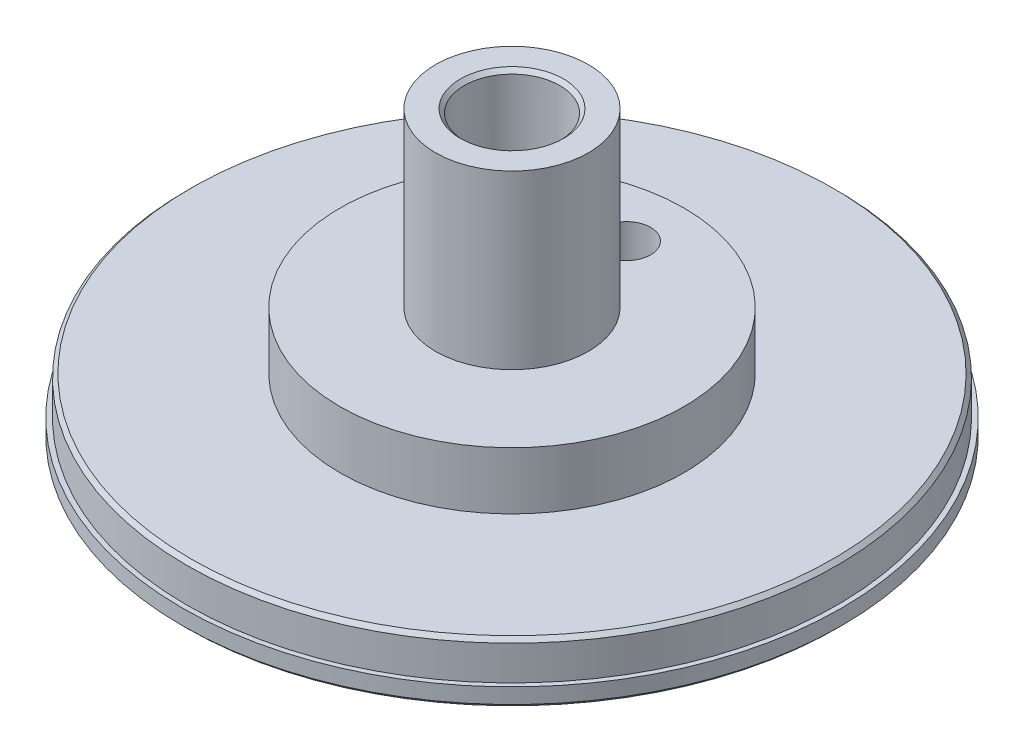
ISO-10303-21;
HEADER;
FILE_DESCRIPTION(('STEP AP214'),'2;1');
FILE_NAME('part.step','',(''),(''),'','','');
FILE_SCHEMA(('AUTOMOTIVE_DESIGN { 1 0 10303 214 1 1 1 1 }'));
ENDSEC;
DATA;
#1=APPLICATION_CONTEXT('core data for automotive mechanical design processes');
#2=APPLICATION_PROTOCOL_DEFINITION('international standard','automotive_design',2000,#1);
#3=PRODUCT_CONTEXT('',#1,'mechanical');
#4=PRODUCT('Part','Part','',(#3));
#5=PRODUCT_RELATED_PRODUCT_CATEGORY('part','',(#4));
#6=PRODUCT_DEFINITION_FORMATION('','',#4);
#7=PRODUCT_DEFINITION_CONTEXT('part definition',#1,'design');
#8=PRODUCT_DEFINITION('design','',#6,#7);
#9=PRODUCT_DEFINITION_SHAPE('','',#8);
#10=(LENGTH_UNIT() NAMED_UNIT(*) SI_UNIT(.MILLI.,.METRE.));
#11=(NAMED_UNIT(*) PLANE_ANGLE_UNIT() SI_UNIT($,.RADIAN.));
#12=(NAMED_UNIT(*) SI_UNIT($,.STERADIAN.) SOLID_ANGLE_UNIT());
#13=UNCERTAINTY_MEASURE_WITH_UNIT(LENGTH_MEASURE(1.E-05),#10,'distance_accuracy_value','');
#14=(GEOMETRIC_REPRESENTATION_CONTEXT(3) GLOBAL_UNCERTAINTY_ASSIGNED_CONTEXT((#13)) GLOBAL_UNIT_ASSIGNED_CONTEXT((#10,
#11,#12)) REPRESENTATION_CONTEXT('',''));
#15=CARTESIAN_POINT('',(0.,0.,0.));
#16=DIRECTION('',(0.,0.,1.));
#17=DIRECTION('',(1.,0.,0.));
#18=AXIS2_PLACEMENT_3D('',#15,#16,#17);
#19=CARTESIAN_POINT('',(0.,3.,0.));
#20=DIRECTION('',(0.,1.,0.));
#21=DIRECTION('',(0.,0.,1.));
#22=AXIS2_PLACEMENT_3D('',#19,#20,#21);
#23=CYLINDRICAL_SURFACE('',#22,9.);
#24=CARTESIAN_POINT('',(0.,3.,0.));
#25=DIRECTION('',(0.,1.,0.));
#26=DIRECTION('',(0.,0.,1.));
#27=AXIS2_PLACEMENT_3D('',#24,#25,#26);
#28=CIRCLE('',#27,9.);
#29=CARTESIAN_POINT('',(0.,3.,9.));
#30=VERTEX_POINT('',#29);
#31=EDGE_CURVE('E87',#30,#30,#28,.T.);
#32=ORIENTED_EDGE('',*,*,#31,.T.);
#33=EDGE_LOOP('',(#32));
#34=FACE_BOUND('',#33,.T.);
#35=CARTESIAN_POINT('',(0.,6.,0.));
#36=DIRECTION('',(0.,1.,0.));
#37=DIRECTION('',(0.,0.,1.));
#38=AXIS2_PLACEMENT_3D('',#35,#36,#37);
#39=CIRCLE('',#38,9.);
#40=CARTESIAN_POINT('',(0.,6.,9.));
#41=VERTEX_POINT('',#40);
#42=EDGE_CURVE('E83',#41,#41,#39,.F.);
#43=ORIENTED_EDGE('',*,*,#42,.T.);
#44=EDGE_LOOP('',(#43));
#45=FACE_BOUND('',#44,.T.);
#46=ADVANCED_FACE('F41',(#34,#45),#23,.T.);
#47=CARTESIAN_POINT('',(0.,0.999999999999999,0.));
#48=DIRECTION('',(0.,1.,0.));
#49=DIRECTION('',(0.,0.,1.));
#50=AXIS2_PLACEMENT_3D('',#47,#48,#49);
#51=CYLINDRICAL_SURFACE('',#50,17.);
#52=CARTESIAN_POINT('',(0.,2.8,0.));
#53=DIRECTION('',(0.,1.,0.));
#54=DIRECTION('',(0.,0.,1.));
#55=AXIS2_PLACEMENT_3D('',#52,#53,#54);
#56=CIRCLE('',#55,17.);
#57=CARTESIAN_POINT('',(0.,2.8,17.));
#58=VERTEX_POINT('',#57);
#59=EDGE_CURVE('E55',#58,#58,#56,.F.);
#60=ORIENTED_EDGE('',*,*,#59,.T.);
#61=EDGE_LOOP('',(#60));
#62=FACE_BOUND('',#61,.T.);
#63=CARTESIAN_POINT('',(0.,0.999999999999999,0.));
#64=DIRECTION('',(0.,1.,0.));
#65=DIRECTION('',(0.,0.,1.));
#66=AXIS2_PLACEMENT_3D('',#63,#64,#65);
#67=CIRCLE('',#66,17.);
#68=CARTESIAN_POINT('',(0.,0.999999999999999,17.));
#69=VERTEX_POINT('',#68);
#70=EDGE_CURVE('E92',#69,#69,#67,.T.);
#71=ORIENTED_EDGE('',*,*,#70,.T.);
#72=EDGE_LOOP('',(#71));
#73=FACE_BOUND('',#72,.T.);
#74=ADVANCED_FACE('F153',(#62,#73),#51,.T.);
#75=CARTESIAN_POINT('',(0.,15.,0.));
#76=DIRECTION('',(0.,-1.,0.));
#77=DIRECTION('',(0.,0.,-1.));
#78=AXIS2_PLACEMENT_3D('',#75,#76,#77);
#79=CYLINDRICAL_SURFACE('',#78,17.25);
#80=CARTESIAN_POINT('',(0.,0.199999999999999,0.));
#81=DIRECTION('',(0.,1.,0.));
#82=DIRECTION('',(0.,0.,1.));
#83=AXIS2_PLACEMENT_3D('',#80,#81,#82);
#84=CIRCLE('',#83,17.25);
#85=CARTESIAN_POINT('',(0.,0.199999999999999,17.25));
#86=VERTEX_POINT('',#85);
#87=EDGE_CURVE('E11',#86,#86,#84,.T.);
#88=ORIENTED_EDGE('',*,*,#87,.T.);
#89=EDGE_LOOP('',(#88));
#90=FACE_BOUND('',#89,.T.);
#91=CARTESIAN_POINT('',(0.,0.999999999999999,0.));
#92=DIRECTION('',(0.,1.,0.));
#93=DIRECTION('',(0.,0.,1.));
#94=AXIS2_PLACEMENT_3D('',#91,#92,#93);
#95=CIRCLE('',#94,17.25);
#96=CARTESIAN_POINT('',(0.,0.999999999999999,17.25));
#97=VERTEX_POINT('',#96);
#98=EDGE_CURVE('E82',#97,#97,#95,.T.);
#99=ORIENTED_EDGE('',*,*,#98,.F.);
#100=EDGE_LOOP('',(#99));
#101=FACE_BOUND('',#100,.T.);
#102=ADVANCED_FACE('F160',(#90,#101),#79,.T.);
#103=CARTESIAN_POINT('',(0.,0.,0.));
#104=DIRECTION('',(0.,1.,0.));
#105=DIRECTION('',(0.,0.,1.));
#106=AXIS2_PLACEMENT_3D('',#103,#104,#105);
#107=PLANE('',#106);
#108=CARTESIAN_POINT('',(0.,0.,0.));
#109=DIRECTION('',(0.,1.,0.));
#110=DIRECTION('',(0.,0.,1.));
#111=AXIS2_PLACEMENT_3D('',#108,#109,#110);
#112=CIRCLE('',#111,2.69999999999999);
#113=CARTESIAN_POINT('',(0.,0.,-2.69999999999999));
#114=VERTEX_POINT('',#113);
#115=EDGE_CURVE('E74',#114,#114,#112,.T.);
#116=ORIENTED_EDGE('',*,*,#115,.T.);
#117=EDGE_LOOP('',(#116));
#118=FACE_BOUND('',#117,.T.);
#119=CARTESIAN_POINT('',(0.,0.,0.));
#120=DIRECTION('',(0.,1.,0.));
#121=DIRECTION('',(0.,0.,1.));
#122=AXIS2_PLACEMENT_3D('',#119,#120,#121);
#123=CIRCLE('',#122,17.05);
#124=CARTESIAN_POINT('',(0.,0.,17.05));
#125=VERTEX_POINT('',#124);
#126=EDGE_CURVE('E78',#125,#125,#123,.F.);
#127=ORIENTED_EDGE('',*,*,#126,.T.);
#128=EDGE_LOOP('',(#127));
#129=FACE_BOUND('',#128,.T.);
#130=CARTESIAN_POINT('',(0.,0.,-6.));
#131=DIRECTION('',(0.,1.,0.));
#132=DIRECTION('',(0.,0.,1.));
#133=AXIS2_PLACEMENT_3D('',#130,#131,#132);
#134=CIRCLE('',#133,1.25);
#135=CARTESIAN_POINT('',(0.,0.,-4.75));
#136=VERTEX_POINT('',#135);
#137=EDGE_CURVE('E103',#136,#136,#134,.T.);
#138=ORIENTED_EDGE('',*,*,#137,.T.);
#139=EDGE_LOOP('',(#138));
#140=FACE_BOUND('',#139,.T.);
#141=ADVANCED_FACE('F115',(#118,#129,#140),#107,.F.);
#142=CARTESIAN_POINT('',(0.,0.999999999999999,0.));
#143=DIRECTION('',(0.,1.,0.));
#144=DIRECTION('',(0.,0.,1.));
#145=AXIS2_PLACEMENT_3D('',#142,#143,#144);
#146=PLANE('',#145);
#147=ORIENTED_EDGE('',*,*,#70,.F.);
#148=EDGE_LOOP('',(#147));
#149=FACE_BOUND('',#148,.T.);
#150=ORIENTED_EDGE('',*,*,#98,.T.);
#151=EDGE_LOOP('',(#150));
#152=FACE_BOUND('',#151,.T.);
#153=ADVANCED_FACE('F165',(#149,#152),#146,.T.);
#154=CARTESIAN_POINT('',(0.,3.,0.));
#155=DIRECTION('',(0.,1.,0.));
#156=DIRECTION('',(0.,0.,1.));
#157=AXIS2_PLACEMENT_3D('',#154,#155,#156);
#158=PLANE('',#157);
#159=CARTESIAN_POINT('',(0.,3.,0.));
#160=DIRECTION('',(0.,1.,0.));
#161=DIRECTION('',(0.,0.,1.));
#162=AXIS2_PLACEMENT_3D('',#159,#160,#161);
#163=CIRCLE('',#162,16.8);
#164=CARTESIAN_POINT('',(0.,3.,16.8));
#165=VERTEX_POINT('',#164);
#166=EDGE_CURVE('E50',#165,#165,#163,.T.);
#167=ORIENTED_EDGE('',*,*,#166,.T.);
#168=EDGE_LOOP('',(#167));
#169=FACE_BOUND('',#168,.T.);
#170=ORIENTED_EDGE('',*,*,#31,.F.);
#171=EDGE_LOOP('',(#170));
#172=FACE_BOUND('',#171,.T.);
#173=ADVANCED_FACE('F129',(#169,#172),#158,.T.);
#174=CARTESIAN_POINT('',(0.,6.,0.));
#175=DIRECTION('',(0.,1.,0.));
#176=DIRECTION('',(0.,0.,1.));
#177=AXIS2_PLACEMENT_3D('',#174,#175,#176);
#178=PLANE('',#177);
#179=CARTESIAN_POINT('',(0.,6.,-6.));
#180=DIRECTION('',(0.,1.,0.));
#181=DIRECTION('',(0.,0.,1.));
#182=AXIS2_PLACEMENT_3D('',#179,#180,#181);
#183=CIRCLE('',#182,1.25);
#184=CARTESIAN_POINT('',(0.,6.,-4.75));
#185=VERTEX_POINT('',#184);
#186=EDGE_CURVE('E107',#185,#185,#183,.T.);
#187=ORIENTED_EDGE('',*,*,#186,.F.);
#188=EDGE_LOOP('',(#187));
#189=FACE_BOUND('',#188,.T.);
#190=ORIENTED_EDGE('',*,*,#42,.F.);
#191=EDGE_LOOP('',(#190));
#192=FACE_BOUND('',#191,.T.);
#193=CARTESIAN_POINT('',(0.,6.,0.));
#194=DIRECTION('',(0.,1.,0.));
#195=DIRECTION('',(0.,0.,1.));
#196=AXIS2_PLACEMENT_3D('',#193,#194,#195);
#197=CIRCLE('',#196,4.);
#198=CARTESIAN_POINT('',(0.,6.,4.));
#199=VERTEX_POINT('',#198);
#200=EDGE_CURVE('E88',#199,#199,#197,.T.);
#201=ORIENTED_EDGE('',*,*,#200,.F.);
#202=EDGE_LOOP('',(#201));
#203=FACE_BOUND('',#202,.T.);
#204=ADVANCED_FACE('F125',(#189,#192,#203),#178,.T.);
#205=CARTESIAN_POINT('',(0.,6.,0.));
#206=DIRECTION('',(0.,1.,0.));
#207=DIRECTION('',(0.,0.,1.));
#208=AXIS2_PLACEMENT_3D('',#205,#206,#207);
#209=CYLINDRICAL_SURFACE('',#208,4.);
#210=ORIENTED_EDGE('',*,*,#200,.T.);
#211=EDGE_LOOP('',(#210));
#212=FACE_BOUND('',#211,.T.);
#213=CARTESIAN_POINT('',(0.,15.,0.));
#214=DIRECTION('',(0.,1.,0.));
#215=DIRECTION('',(0.,0.,1.));
#216=AXIS2_PLACEMENT_3D('',#213,#214,#215);
#217=CIRCLE('',#216,4.);
#218=CARTESIAN_POINT('',(0.,15.,4.));
#219=VERTEX_POINT('',#218);
#220=EDGE_CURVE('E99',#219,#219,#217,.T.);
#221=ORIENTED_EDGE('',*,*,#220,.F.);
#222=EDGE_LOOP('',(#221));
#223=FACE_BOUND('',#222,.T.);
#224=ADVANCED_FACE('F128',(#212,#223),#209,.T.);
#225=CARTESIAN_POINT('',(0.,15.,0.));
#226=DIRECTION('',(0.,1.,0.));
#227=DIRECTION('',(0.,0.,1.));
#228=AXIS2_PLACEMENT_3D('',#225,#226,#227);
#229=PLANE('',#228);
#230=CARTESIAN_POINT('',(0.,15.,0.));
#231=DIRECTION('',(0.,1.,0.));
#232=DIRECTION('',(0.,0.,1.));
#233=AXIS2_PLACEMENT_3D('',#230,#231,#232);
#234=CIRCLE('',#233,2.69999999999999);
#235=CARTESIAN_POINT('',(0.,15.,2.69999999999999));
#236=VERTEX_POINT('',#235);
#237=EDGE_CURVE('E60',#236,#236,#234,.F.);
#238=ORIENTED_EDGE('',*,*,#237,.T.);
#239=EDGE_LOOP('',(#238));
#240=FACE_BOUND('',#239,.T.);
#241=ORIENTED_EDGE('',*,*,#220,.T.);
#242=EDGE_LOOP('',(#241));
#243=FACE_BOUND('',#242,.T.);
#244=ADVANCED_FACE('F137',(#240,#243),#229,.T.);
#245=CARTESIAN_POINT('',(0.,0.,0.));
#246=DIRECTION('',(0.,1.,0.));
#247=DIRECTION('',(0.,0.,1.));
#248=AXIS2_PLACEMENT_3D('',#245,#246,#247);
#249=CYLINDRICAL_SURFACE('',#248,2.5);
#250=CARTESIAN_POINT('',(0.,0.199999999999994,0.));
#251=DIRECTION('',(0.,1.,0.));
#252=DIRECTION('',(0.,0.,1.));
#253=AXIS2_PLACEMENT_3D('',#250,#251,#252);
#254=CIRCLE('',#253,2.5);
#255=CARTESIAN_POINT('',(0.,0.199999999999994,-2.5));
#256=VERTEX_POINT('',#255);
#257=EDGE_CURVE('E66',#256,#256,#254,.F.);
#258=ORIENTED_EDGE('',*,*,#257,.T.);
#259=EDGE_LOOP('',(#258));
#260=FACE_BOUND('',#259,.T.);
#261=CARTESIAN_POINT('',(0.,14.8,0.));
#262=DIRECTION('',(0.,1.,0.));
#263=DIRECTION('',(0.,0.,1.));
#264=AXIS2_PLACEMENT_3D('',#261,#262,#263);
#265=CIRCLE('',#264,2.5);
#266=CARTESIAN_POINT('',(0.,14.8,2.5));
#267=VERTEX_POINT('',#266);
#268=EDGE_CURVE('E70',#267,#267,#265,.T.);
#269=ORIENTED_EDGE('',*,*,#268,.T.);
#270=EDGE_LOOP('',(#269));
#271=FACE_BOUND('',#270,.T.);
#272=ADVANCED_FACE('F121',(#260,#271),#249,.F.);
#273=CARTESIAN_POINT('',(0.,0.,-6.));
#274=DIRECTION('',(0.,1.,0.));
#275=DIRECTION('',(0.,0.,1.));
#276=AXIS2_PLACEMENT_3D('',#273,#274,#275);
#277=CYLINDRICAL_SURFACE('',#276,1.25);
#278=ORIENTED_EDGE('',*,*,#137,.F.);
#279=EDGE_LOOP('',(#278));
#280=FACE_BOUND('',#279,.T.);
#281=ORIENTED_EDGE('',*,*,#186,.T.);
#282=EDGE_LOOP('',(#281));
#283=FACE_BOUND('',#282,.T.);
#284=ADVANCED_FACE('F117',(#280,#283),#277,.F.);
#285=CARTESIAN_POINT('',(0.,0.,0.));
#286=DIRECTION('',(0.,-1.,0.));
#287=DIRECTION('',(0.,0.,-1.));
#288=AXIS2_PLACEMENT_3D('',#285,#286,#287);
#289=CONICAL_SURFACE('',#288,2.69999999999999,0.785398163397447);
#290=CARTESIAN_POINT('',(0.,0.199999999999994,-2.5));
#291=CARTESIAN_POINT('',(0.,0.197916666666661,-2.50208333333333));
#292=CARTESIAN_POINT('',(0.,0.195833333333328,-2.50416666666667));
#293=CARTESIAN_POINT('',(0.,0.191666666666661,-2.50833333333333));
#294=CARTESIAN_POINT('',(0.,0.189583333333328,-2.51041666666667));
#295=CARTESIAN_POINT('',(0.,0.185416666666662,-2.51458333333333));
#296=CARTESIAN_POINT('',(0.,0.183333333333328,-2.51666666666667));
#297=CARTESIAN_POINT('',(0.,0.179166666666662,-2.52083333333333));
#298=CARTESIAN_POINT('',(0.,0.177083333333328,-2.52291666666667));
#299=CARTESIAN_POINT('',(0.,0.172916666666662,-2.52708333333333));
#300=CARTESIAN_POINT('',(0.,0.170833333333329,-2.52916666666667));
#301=CARTESIAN_POINT('',(0.,0.166666666666662,-2.53333333333333));
#302=CARTESIAN_POINT('',(0.,0.164583333333329,-2.53541666666667));
#303=CARTESIAN_POINT('',(0.,0.160416666666662,-2.53958333333333));
#304=CARTESIAN_POINT('',(0.,0.158333333333329,-2.54166666666667));
#305=CARTESIAN_POINT('',(0.,0.154166666666662,-2.54583333333333));
#306=CARTESIAN_POINT('',(0.,0.152083333333329,-2.54791666666667));
#307=CARTESIAN_POINT('',(0.,0.147916666666663,-2.55208333333333));
#308=CARTESIAN_POINT('',(0.,0.145833333333329,-2.55416666666666));
#309=CARTESIAN_POINT('',(0.,0.141666666666663,-2.55833333333333));
#310=CARTESIAN_POINT('',(0.,0.139583333333329,-2.56041666666667));
#311=CARTESIAN_POINT('',(0.,0.135416666666663,-2.56458333333333));
#312=CARTESIAN_POINT('',(0.,0.13333333333333,-2.56666666666666));
#313=CARTESIAN_POINT('',(0.,0.129166666666663,-2.57083333333333));
#314=CARTESIAN_POINT('',(0.,0.12708333333333,-2.57291666666666));
#315=CARTESIAN_POINT('',(0.,0.122916666666663,-2.57708333333333));
#316=CARTESIAN_POINT('',(0.,0.12083333333333,-2.57916666666666));
#317=CARTESIAN_POINT('',(0.,0.116666666666663,-2.58333333333333));
#318=CARTESIAN_POINT('',(0.,0.11458333333333,-2.58541666666666));
#319=CARTESIAN_POINT('',(0.,0.110416666666664,-2.58958333333333));
#320=CARTESIAN_POINT('',(0.,0.10833333333333,-2.59166666666666));
#321=CARTESIAN_POINT('',(0.,0.104166666666664,-2.59583333333333));
#322=CARTESIAN_POINT('',(0.,0.10208333333333,-2.59791666666666));
#323=CARTESIAN_POINT('',(0.,0.0979166666666639,-2.60208333333333));
#324=CARTESIAN_POINT('',(0.,0.0958333333333307,-2.60416666666666));
#325=CARTESIAN_POINT('',(0.,0.0916666666666642,-2.60833333333333));
#326=CARTESIAN_POINT('',(0.,0.0895833333333309,-2.61041666666666));
#327=CARTESIAN_POINT('',(0.,0.0854166666666643,-2.61458333333333));
#328=CARTESIAN_POINT('',(0.,0.083333333333331,-2.61666666666666));
#329=CARTESIAN_POINT('',(0.,0.0791666666666645,-2.62083333333333));
#330=CARTESIAN_POINT('',(0.,0.0770833333333312,-2.62291666666666));
#331=CARTESIAN_POINT('',(0.,0.0729166666666647,-2.62708333333333));
#332=CARTESIAN_POINT('',(0.,0.0708333333333314,-2.62916666666666));
#333=CARTESIAN_POINT('',(0.,0.0666666666666648,-2.63333333333333));
#334=CARTESIAN_POINT('',(0.,0.0645833333333315,-2.63541666666666));
#335=CARTESIAN_POINT('',(0.,0.060416666666665,-2.63958333333333));
#336=CARTESIAN_POINT('',(0.,0.0583333333333318,-2.64166666666666));
#337=CARTESIAN_POINT('',(0.,0.0541666666666652,-2.64583333333333));
#338=CARTESIAN_POINT('',(0.,0.0520833333333319,-2.64791666666666));
#339=CARTESIAN_POINT('',(0.,0.0479166666666653,-2.65208333333333));
#340=CARTESIAN_POINT('',(0.,0.0458333333333321,-2.65416666666666));
#341=CARTESIAN_POINT('',(0.,0.0416666666666655,-2.65833333333333));
#342=CARTESIAN_POINT('',(0.,0.0395833333333322,-2.66041666666666));
#343=CARTESIAN_POINT('',(0.,0.0354166666666657,-2.66458333333333));
#344=CARTESIAN_POINT('',(0.,0.0333333333333324,-2.66666666666666));
#345=CARTESIAN_POINT('',(0.,0.0291666666666658,-2.67083333333333));
#346=CARTESIAN_POINT('',(0.,0.0270833333333325,-2.67291666666666));
#347=CARTESIAN_POINT('',(0.,0.022916666666666,-2.67708333333333));
#348=CARTESIAN_POINT('',(0.,0.0208333333333328,-2.67916666666666));
#349=CARTESIAN_POINT('',(0.,0.0166666666666662,-2.68333333333333));
#350=CARTESIAN_POINT('',(0.,0.0145833333333329,-2.68541666666666));
#351=CARTESIAN_POINT('',(0.,0.0104166666666664,-2.68958333333333));
#352=CARTESIAN_POINT('',(0.,0.0083333333333331,-2.69166666666666));
#353=CARTESIAN_POINT('',(0.,0.00416666666666656,-2.69583333333333));
#354=CARTESIAN_POINT('',(0.,0.00208333333333329,-2.69791666666666));
#355=CARTESIAN_POINT('',(0.,0.,-2.69999999999999));
#356=B_SPLINE_CURVE_WITH_KNOTS('',3,(#290,#291,#292,#293,#294,#295,#296,#297,#298,#299,#300,
#301,#302,#303,#304,#305,#306,#307,#308,#309,#310,#311,#312,#313,#314,#315,#316,#317,#318,#319,
#320,#321,#322,#323,#324,#325,#326,#327,#328,#329,#330,#331,#332,#333,#334,#335,#336,#337,#338,
#339,#340,#341,#342,#343,#344,#345,#346,#347,#348,#349,#350,#351,#352,#353,#354,#355),
.UNSPECIFIED.,.F.,.F.,(4,2,2,2,2,2,2,2,2,2,2,2,2,2,2,2,2,2,2,2,2,2,2,2,2,2,2,2,2,2,2,2,4),(0.,
0.00883883476483154,0.0176776695296631,0.0265165042944946,0.0353553390593265,0.044194173824158,
0.0530330085889896,0.0618718433538211,0.0707106781186526,0.0795495128834842,0.0883883476483157,
0.0972271824131476,0.106066017177979,0.114904851942811,0.123743686707642,0.132582521472474,
0.141421356237305,0.150260191002137,0.159099025766969,0.1679378605318,0.176776695296632,
0.185615530061463,0.194454364826295,0.203293199591127,0.212132034355958,0.22097086912079,
0.229809703885621,0.238648538650453,0.247487373415284,0.256326208180116,0.265165042944948,
0.274003877709779,0.282842712474611),.UNSPECIFIED.);
#357=EDGE_CURVE('BSEAM120',#256,#114,#356,.T.);
#358=ORIENTED_EDGE('',*,*,#257,.F.);
#359=ORIENTED_EDGE('',*,*,#115,.F.);
#360=ORIENTED_EDGE('',*,*,#357,.T.);
#361=ORIENTED_EDGE('',*,*,#357,.F.);
#362=EDGE_LOOP('',(#358,#360,#359,#361));
#363=FACE_BOUND('',#362,.T.);
#364=ADVANCED_FACE('F120',(#363),#289,.F.);
#365=CARTESIAN_POINT('',(0.,14.8,0.));
#366=DIRECTION('',(0.,1.,0.));
#367=DIRECTION('',(0.,0.,1.));
#368=AXIS2_PLACEMENT_3D('',#365,#366,#367);
#369=CONICAL_SURFACE('',#368,2.5,0.785398163397436);
#370=ORIENTED_EDGE('',*,*,#237,.F.);
#371=EDGE_LOOP('',(#370));
#372=FACE_BOUND('',#371,.T.);
#373=ORIENTED_EDGE('',*,*,#268,.F.);
#374=EDGE_LOOP('',(#373));
#375=FACE_BOUND('',#374,.T.);
#376=ADVANCED_FACE('F189',(#372,#375),#369,.F.);
#377=CARTESIAN_POINT('',(0.,2.8,0.));
#378=DIRECTION('',(0.,-1.,0.));
#379=DIRECTION('',(0.,0.,-1.));
#380=AXIS2_PLACEMENT_3D('',#377,#378,#379);
#381=CONICAL_SURFACE('',#380,17.,0.78539816339744);
#382=ORIENTED_EDGE('',*,*,#166,.F.);
#383=EDGE_LOOP('',(#382));
#384=FACE_BOUND('',#383,.T.);
#385=ORIENTED_EDGE('',*,*,#59,.F.);
#386=EDGE_LOOP('',(#385));
#387=FACE_BOUND('',#386,.T.);
#388=ADVANCED_FACE('F195',(#384,#387),#381,.T.);
#389=CARTESIAN_POINT('',(0.,0.199999999999999,0.));
#390=DIRECTION('',(0.,1.,0.));
#391=DIRECTION('',(0.,0.,1.));
#392=AXIS2_PLACEMENT_3D('',#389,#390,#391);
#393=CONICAL_SURFACE('',#392,17.25,0.785398163397457);
#394=ORIENTED_EDGE('',*,*,#126,.F.);
#395=EDGE_LOOP('',(#394));
#396=FACE_BOUND('',#395,.T.);
#397=ORIENTED_EDGE('',*,*,#87,.F.);
#398=EDGE_LOOP('',(#397));
#399=FACE_BOUND('',#398,.T.);
#400=ADVANCED_FACE('F44',(#396,#399),#393,.T.);
#401=CLOSED_SHELL('',(#46,#74,#102,#141,#153,#173,#204,#224,#244,#272,#284,#364,#376,#388,#400));
#402=MANIFOLD_SOLID_BREP('B2',#401);
#403=ADVANCED_BREP_SHAPE_REPRESENTATION('',(#18,#402),#14);
#404=SHAPE_DEFINITION_REPRESENTATION(#9,#403);
ENDSEC;
END-ISO-10303-21;
